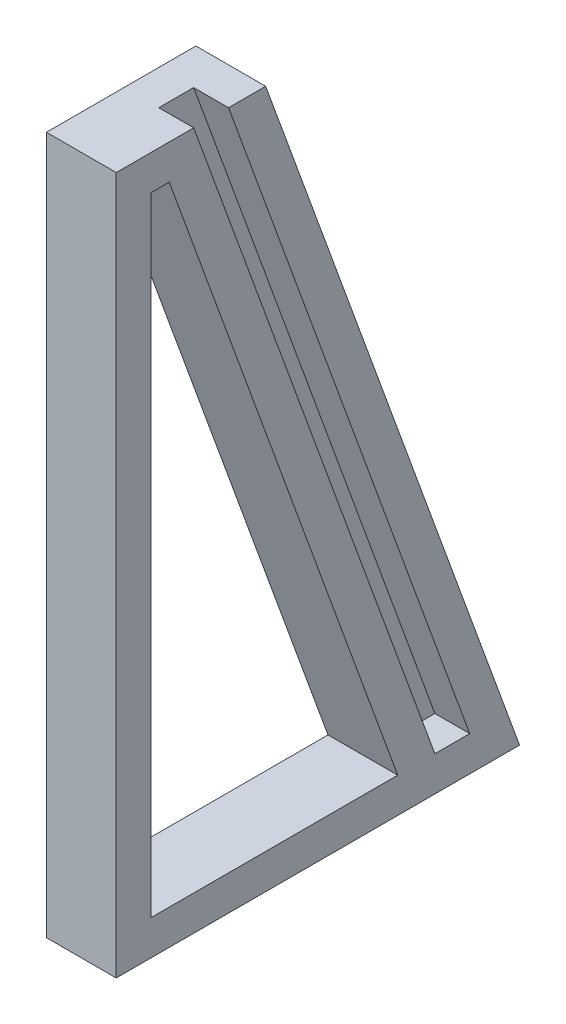
ISO-10303-21;
HEADER;
FILE_DESCRIPTION(('STEP AP214'),'2;1');
FILE_NAME('part.step','',(''),(''),'','','');
FILE_SCHEMA(('AUTOMOTIVE_DESIGN { 1 0 10303 214 1 1 1 1 }'));
ENDSEC;
DATA;
#1=APPLICATION_CONTEXT('core data for automotive mechanical design processes');
#2=APPLICATION_PROTOCOL_DEFINITION('international standard','automotive_design',2000,#1);
#3=PRODUCT_CONTEXT('',#1,'mechanical');
#4=PRODUCT('Part','Part','',(#3));
#5=PRODUCT_RELATED_PRODUCT_CATEGORY('part','',(#4));
#6=PRODUCT_DEFINITION_FORMATION('','',#4);
#7=PRODUCT_DEFINITION_CONTEXT('part definition',#1,'design');
#8=PRODUCT_DEFINITION('design','',#6,#7);
#9=PRODUCT_DEFINITION_SHAPE('','',#8);
#10=(LENGTH_UNIT() NAMED_UNIT(*) SI_UNIT(.MILLI.,.METRE.));
#11=(NAMED_UNIT(*) PLANE_ANGLE_UNIT() SI_UNIT($,.RADIAN.));
#12=(NAMED_UNIT(*) SI_UNIT($,.STERADIAN.) SOLID_ANGLE_UNIT());
#13=UNCERTAINTY_MEASURE_WITH_UNIT(LENGTH_MEASURE(1.E-05),#10,'distance_accuracy_value','');
#14=(GEOMETRIC_REPRESENTATION_CONTEXT(3) GLOBAL_UNCERTAINTY_ASSIGNED_CONTEXT((#13)) GLOBAL_UNIT_ASSIGNED_CONTEXT((#10,
#11,#12)) REPRESENTATION_CONTEXT('',''));
#15=CARTESIAN_POINT('',(0.,0.,0.));
#16=DIRECTION('',(0.,0.,1.));
#17=DIRECTION('',(1.,0.,0.));
#18=AXIS2_PLACEMENT_3D('',#15,#16,#17);
#19=CARTESIAN_POINT('',(10.,-50.,50.));
#20=DIRECTION('',(0.,1.,0.));
#21=DIRECTION('',(0.,0.,1.));
#22=AXIS2_PLACEMENT_3D('',#19,#20,#21);
#23=PLANE('',#22);
#24=DIRECTION('',(-1.,0.,0.));
#25=VECTOR('',#24,1.);
#26=CARTESIAN_POINT('',(0.,-50.,2.32088886));
#27=LINE('',#26,#25);
#28=CARTESIAN_POINT('',(8.,-50.,2.32088886));
#29=VERTEX_POINT('',#28);
#30=CARTESIAN_POINT('',(2.,-50.,2.32088886));
#31=VERTEX_POINT('',#30);
#32=EDGE_CURVE('E61',#29,#31,#27,.T.);
#33=ORIENTED_EDGE('',*,*,#32,.T.);
#34=DIRECTION('',(0.,0.,-1.));
#35=VECTOR('',#34,1.);
#36=CARTESIAN_POINT('',(2.,-50.,0.));
#37=LINE('',#36,#35);
#38=CARTESIAN_POINT('',(2.,-50.,8.32088886));
#39=VERTEX_POINT('',#38);
#40=EDGE_CURVE('E270',#39,#31,#37,.T.);
#41=ORIENTED_EDGE('',*,*,#40,.F.);
#42=DIRECTION('',(-1.,0.,0.));
#43=VECTOR('',#42,1.);
#44=CARTESIAN_POINT('',(0.,-50.,8.32088886));
#45=LINE('',#44,#43);
#46=CARTESIAN_POINT('',(8.,-50.,8.32088886));
#47=VERTEX_POINT('',#46);
#48=EDGE_CURVE('E283',#47,#39,#45,.T.);
#49=ORIENTED_EDGE('',*,*,#48,.F.);
#50=DIRECTION('',(0.,0.,-1.));
#51=VECTOR('',#50,1.);
#52=CARTESIAN_POINT('',(8.00000000000001,-50.,0.));
#53=LINE('',#52,#51);
#54=EDGE_CURVE('E280',#47,#29,#53,.T.);
#55=ORIENTED_EDGE('',*,*,#54,.T.);
#56=EDGE_LOOP('',(#33,#41,#49,#55));
#57=FACE_BOUND('',#56,.T.);
#58=DIRECTION('',(0.,0.,-1.));
#59=VECTOR('',#58,1.);
#60=CARTESIAN_POINT('',(2.00000000000001,-50.,0.));
#61=LINE('',#60,#59);
#62=CARTESIAN_POINT('',(2.,-50.,48.));
#63=VERTEX_POINT('',#62);
#64=CARTESIAN_POINT('',(2.,-50.,42.));
#65=VERTEX_POINT('',#64);
#66=EDGE_CURVE('E250',#63,#65,#61,.T.);
#67=ORIENTED_EDGE('',*,*,#66,.F.);
#68=DIRECTION('',(-1.,0.,0.));
#69=VECTOR('',#68,1.);
#70=CARTESIAN_POINT('',(0.,-50.,48.));
#71=LINE('',#70,#69);
#72=CARTESIAN_POINT('',(8.,-50.,48.));
#73=VERTEX_POINT('',#72);
#74=EDGE_CURVE('E53',#73,#63,#71,.T.);
#75=ORIENTED_EDGE('',*,*,#74,.F.);
#76=DIRECTION('',(0.,0.,-1.));
#77=VECTOR('',#76,1.);
#78=CARTESIAN_POINT('',(8.,-50.,0.));
#79=LINE('',#78,#77);
#80=CARTESIAN_POINT('',(8.,-50.,42.));
#81=VERTEX_POINT('',#80);
#82=EDGE_CURVE('E241',#73,#81,#79,.T.);
#83=ORIENTED_EDGE('',*,*,#82,.T.);
#84=DIRECTION('',(-1.,0.,0.));
#85=VECTOR('',#84,1.);
#86=CARTESIAN_POINT('',(0.,-50.,42.));
#87=LINE('',#86,#85);
#88=EDGE_CURVE('E254',#81,#65,#87,.T.);
#89=ORIENTED_EDGE('',*,*,#88,.T.);
#90=EDGE_LOOP('',(#67,#75,#83,#89));
#91=FACE_BOUND('',#90,.T.);
#92=DIRECTION('',(0.,0.,-1.));
#93=VECTOR('',#92,1.);
#94=CARTESIAN_POINT('',(0.,-50.,50.));
#95=LINE('',#94,#93);
#96=CARTESIAN_POINT('',(0.,-50.,50.));
#97=VERTEX_POINT('',#96);
#98=CARTESIAN_POINT('',(0.,-50.,-7.82088886237959));
#99=VERTEX_POINT('',#98);
#100=EDGE_CURVE('E192',#97,#99,#95,.T.);
#101=ORIENTED_EDGE('',*,*,#100,.T.);
#102=DIRECTION('',(-1.,0.,0.));
#103=VECTOR('',#102,1.);
#104=CARTESIAN_POINT('',(10.,-50.,-7.82088886237959));
#105=LINE('',#104,#103);
#106=CARTESIAN_POINT('',(10.,-50.,-7.82088886237959));
#107=VERTEX_POINT('',#106);
#108=EDGE_CURVE('E190',#107,#99,#105,.T.);
#109=ORIENTED_EDGE('',*,*,#108,.F.);
#110=DIRECTION('',(0.,0.,-1.));
#111=VECTOR('',#110,1.);
#112=CARTESIAN_POINT('',(10.,-50.,50.));
#113=LINE('',#112,#111);
#114=CARTESIAN_POINT('',(10.,-50.,50.));
#115=VERTEX_POINT('',#114);
#116=EDGE_CURVE('E176',#115,#107,#113,.T.);
#117=ORIENTED_EDGE('',*,*,#116,.F.);
#118=DIRECTION('',(-1.,0.,0.));
#119=VECTOR('',#118,1.);
#120=CARTESIAN_POINT('',(10.,-50.,50.));
#121=LINE('',#120,#119);
#122=EDGE_CURVE('E46',#115,#97,#121,.T.);
#123=ORIENTED_EDGE('',*,*,#122,.T.);
#124=EDGE_LOOP('',(#101,#109,#117,#123));
#125=FACE_BOUND('',#124,.T.);
#126=ADVANCED_FACE('F38',(#57,#91,#125),#23,.F.);
#127=CARTESIAN_POINT('',(10.,0.,0.));
#128=DIRECTION('',(1.,0.,0.));
#129=DIRECTION('',(0.,0.,-1.));
#130=AXIS2_PLACEMENT_3D('',#127,#128,#129);
#131=PLANE('',#130);
#132=DIRECTION('',(0.,-0.939692620785907,-0.342020143325673));
#133=VECTOR('',#132,1.);
#134=CARTESIAN_POINT('',(10.,-45.,4.31985117133103));
#135=LINE('',#134,#133);
#136=CARTESIAN_POINT('',(10.,50.,38.8970234266207));
#137=VERTEX_POINT('',#136);
#138=CARTESIAN_POINT('',(10.,-45.,4.31985117133103));
#139=VERTEX_POINT('',#138);
#140=EDGE_CURVE('E212',#137,#139,#135,.T.);
#141=ORIENTED_EDGE('',*,*,#140,.F.);
#142=DIRECTION('',(0.,0.,1.));
#143=VECTOR('',#142,1.);
#144=CARTESIAN_POINT('',(10.,50.,50.));
#145=LINE('',#144,#143);
#146=CARTESIAN_POINT('',(10.,50.,50.));
#147=VERTEX_POINT('',#146);
#148=EDGE_CURVE('E325',#137,#147,#145,.T.);
#149=ORIENTED_EDGE('',*,*,#148,.T.);
#150=DIRECTION('',(0.,-1.,0.));
#151=VECTOR('',#150,1.);
#152=CARTESIAN_POINT('',(10.,50.,50.));
#153=LINE('',#152,#151);
#154=EDGE_CURVE('E184',#147,#115,#153,.T.);
#155=ORIENTED_EDGE('',*,*,#154,.T.);
#156=ORIENTED_EDGE('',*,*,#116,.T.);
#157=DIRECTION('',(0.,-0.939692620785907,-0.342020143325672));
#158=VECTOR('',#157,1.);
#159=CARTESIAN_POINT('',(10.,-3.33530369328913,9.16367158433538));
#160=LINE('',#159,#158);
#161=CARTESIAN_POINT('',(10.,50.,28.5761345642411));
#162=VERTEX_POINT('',#161);
#163=EDGE_CURVE('E182',#162,#107,#160,.T.);
#164=ORIENTED_EDGE('',*,*,#163,.F.);
#165=DIRECTION('',(0.,0.,1.));
#166=VECTOR('',#165,1.);
#167=CARTESIAN_POINT('',(10.,50.,0.));
#168=LINE('',#167,#166);
#169=CARTESIAN_POINT('',(10.,50.,33.8970234266207));
#170=VERTEX_POINT('',#169);
#171=EDGE_CURVE('E197',#162,#170,#168,.T.);
#172=ORIENTED_EDGE('',*,*,#171,.T.);
#173=DIRECTION('',(0.,-0.939692620785907,-0.342020143325673));
#174=VECTOR('',#173,1.);
#175=CARTESIAN_POINT('',(10.,-5.0454044099175,13.8621346882649));
#176=LINE('',#175,#174);
#177=CARTESIAN_POINT('',(10.,-45.,-0.680148828668979));
#178=VERTEX_POINT('',#177);
#179=EDGE_CURVE('E203',#170,#178,#176,.T.);
#180=ORIENTED_EDGE('',*,*,#179,.T.);
#181=DIRECTION('',(0.,0.,-1.));
#182=VECTOR('',#181,1.);
#183=CARTESIAN_POINT('',(10.,-45.,-0.680148828668972));
#184=LINE('',#183,#182);
#185=EDGE_CURVE('E218',#139,#178,#184,.T.);
#186=ORIENTED_EDGE('',*,*,#185,.F.);
#187=EDGE_LOOP('',(#141,#149,#155,#156,#164,#172,#180,#186));
#188=FACE_BOUND('',#187,.T.);
#189=DIRECTION('',(0.,-1.,0.));
#190=VECTOR('',#189,1.);
#191=CARTESIAN_POINT('',(10.,0.,45.));
#192=LINE('',#191,#190);
#193=CARTESIAN_POINT('',(10.,45.,45.));
#194=VERTEX_POINT('',#193);
#195=CARTESIAN_POINT('',(10.,-45.,45.));
#196=VERTEX_POINT('',#195);
#197=EDGE_CURVE('E302',#194,#196,#192,.T.);
#198=ORIENTED_EDGE('',*,*,#197,.F.);
#199=DIRECTION('',(0.,0.,1.));
#200=VECTOR('',#199,1.);
#201=CARTESIAN_POINT('',(10.,45.0000000000001,1.20006748735049E-13));
#202=LINE('',#201,#200);
#203=CARTESIAN_POINT('',(10.,45.,42.3980611176692));
#204=VERTEX_POINT('',#203);
#205=EDGE_CURVE('E294',#204,#194,#202,.T.);
#206=ORIENTED_EDGE('',*,*,#205,.F.);
#207=DIRECTION('',(0.,0.939692620785907,0.342020143325672));
#208=VECTOR('',#207,1.);
#209=CARTESIAN_POINT('',(10.,-8.36247415076222,22.9757088999919));
#210=LINE('',#209,#208);
#211=CARTESIAN_POINT('',(10.,-45.,9.64074003371058));
#212=VERTEX_POINT('',#211);
#213=EDGE_CURVE('E296',#212,#204,#210,.T.);
#214=ORIENTED_EDGE('',*,*,#213,.F.);
#215=DIRECTION('',(0.,0.,-1.));
#216=VECTOR('',#215,1.);
#217=CARTESIAN_POINT('',(10.,-45.,0.));
#218=LINE('',#217,#216);
#219=EDGE_CURVE('E299',#196,#212,#218,.T.);
#220=ORIENTED_EDGE('',*,*,#219,.F.);
#221=EDGE_LOOP('',(#198,#206,#214,#220));
#222=FACE_BOUND('',#221,.T.);
#223=ADVANCED_FACE('F179',(#188,#222),#131,.T.);
#224=CARTESIAN_POINT('',(0.,0.,0.));
#225=DIRECTION('',(1.,0.,0.));
#226=DIRECTION('',(0.,0.,-1.));
#227=AXIS2_PLACEMENT_3D('',#224,#225,#226);
#228=PLANE('',#227);
#229=DIRECTION('',(0.,0.,1.));
#230=VECTOR('',#229,1.);
#231=CARTESIAN_POINT('',(0.,45.0000000000001,1.20006748735049E-13));
#232=LINE('',#231,#230);
#233=CARTESIAN_POINT('',(0.,45.,42.3980611176692));
#234=VERTEX_POINT('',#233);
#235=CARTESIAN_POINT('',(0.,45.,45.));
#236=VERTEX_POINT('',#235);
#237=EDGE_CURVE('E261',#234,#236,#232,.T.);
#238=ORIENTED_EDGE('',*,*,#237,.T.);
#239=DIRECTION('',(0.,-1.,0.));
#240=VECTOR('',#239,1.);
#241=CARTESIAN_POINT('',(0.,0.,45.));
#242=LINE('',#241,#240);
#243=CARTESIAN_POINT('',(0.,-45.,45.));
#244=VERTEX_POINT('',#243);
#245=EDGE_CURVE('E297',#236,#244,#242,.T.);
#246=ORIENTED_EDGE('',*,*,#245,.T.);
#247=DIRECTION('',(0.,0.,-1.));
#248=VECTOR('',#247,1.);
#249=CARTESIAN_POINT('',(0.,-45.,0.));
#250=LINE('',#249,#248);
#251=CARTESIAN_POINT('',(0.,-45.,9.64074003371059));
#252=VERTEX_POINT('',#251);
#253=EDGE_CURVE('E310',#244,#252,#250,.T.);
#254=ORIENTED_EDGE('',*,*,#253,.T.);
#255=DIRECTION('',(0.,0.939692620785907,0.342020143325672));
#256=VECTOR('',#255,1.);
#257=CARTESIAN_POINT('',(0.,-8.36247415076222,22.9757088999919));
#258=LINE('',#257,#256);
#259=EDGE_CURVE('E307',#252,#234,#258,.T.);
#260=ORIENTED_EDGE('',*,*,#259,.T.);
#261=EDGE_LOOP('',(#238,#246,#254,#260));
#262=FACE_BOUND('',#261,.T.);
#263=DIRECTION('',(0.,0.,1.));
#264=VECTOR('',#263,1.);
#265=CARTESIAN_POINT('',(0.,50.,50.));
#266=LINE('',#265,#264);
#267=CARTESIAN_POINT('',(0.,50.,28.5761345642411));
#268=VERTEX_POINT('',#267);
#269=CARTESIAN_POINT('',(0.,50.,50.));
#270=VERTEX_POINT('',#269);
#271=EDGE_CURVE('E318',#268,#270,#266,.T.);
#272=ORIENTED_EDGE('',*,*,#271,.F.);
#273=DIRECTION('',(0.,-0.939692620785907,-0.342020143325672));
#274=VECTOR('',#273,1.);
#275=CARTESIAN_POINT('',(0.,-3.33530369328913,9.16367158433538));
#276=LINE('',#275,#274);
#277=EDGE_CURVE('E204',#268,#99,#276,.T.);
#278=ORIENTED_EDGE('',*,*,#277,.T.);
#279=ORIENTED_EDGE('',*,*,#100,.F.);
#280=DIRECTION('',(0.,-1.,0.));
#281=VECTOR('',#280,1.);
#282=CARTESIAN_POINT('',(0.,50.,50.));
#283=LINE('',#282,#281);
#284=EDGE_CURVE('E329',#270,#97,#283,.T.);
#285=ORIENTED_EDGE('',*,*,#284,.F.);
#286=EDGE_LOOP('',(#272,#278,#279,#285));
#287=FACE_BOUND('',#286,.T.);
#288=ADVANCED_FACE('F334',(#262,#287),#228,.F.);
#289=CARTESIAN_POINT('',(10.,50.,50.));
#290=DIRECTION('',(0.,-1.,0.));
#291=DIRECTION('',(0.,0.,-1.));
#292=AXIS2_PLACEMENT_3D('',#289,#290,#291);
#293=PLANE('',#292);
#294=ORIENTED_EDGE('',*,*,#148,.F.);
#295=DIRECTION('',(1.,0.,0.));
#296=VECTOR('',#295,1.);
#297=CARTESIAN_POINT('',(5.,50.,38.8970234266207));
#298=LINE('',#297,#296);
#299=CARTESIAN_POINT('',(5.,50.,38.8970234266207));
#300=VERTEX_POINT('',#299);
#301=EDGE_CURVE('E232',#300,#137,#298,.T.);
#302=ORIENTED_EDGE('',*,*,#301,.F.);
#303=DIRECTION('',(0.,0.,1.));
#304=VECTOR('',#303,1.);
#305=CARTESIAN_POINT('',(5.,50.,38.8970234266207));
#306=LINE('',#305,#304);
#307=CARTESIAN_POINT('',(5.,50.,33.8970234266207));
#308=VERTEX_POINT('',#307);
#309=EDGE_CURVE('E224',#308,#300,#306,.T.);
#310=ORIENTED_EDGE('',*,*,#309,.F.);
#311=DIRECTION('',(-1.,0.,0.));
#312=VECTOR('',#311,1.);
#313=CARTESIAN_POINT('',(10.,50.,33.8970234266207));
#314=LINE('',#313,#312);
#315=EDGE_CURVE('E196',#170,#308,#314,.T.);
#316=ORIENTED_EDGE('',*,*,#315,.F.);
#317=ORIENTED_EDGE('',*,*,#171,.F.);
#318=DIRECTION('',(-1.,0.,0.));
#319=VECTOR('',#318,1.);
#320=CARTESIAN_POINT('',(10.,50.,28.5761345642411));
#321=LINE('',#320,#319);
#322=EDGE_CURVE('E201',#162,#268,#321,.T.);
#323=ORIENTED_EDGE('',*,*,#322,.T.);
#324=ORIENTED_EDGE('',*,*,#271,.T.);
#325=DIRECTION('',(-1.,0.,0.));
#326=VECTOR('',#325,1.);
#327=CARTESIAN_POINT('',(10.,50.,50.));
#328=LINE('',#327,#326);
#329=EDGE_CURVE('E11',#147,#270,#328,.T.);
#330=ORIENTED_EDGE('',*,*,#329,.F.);
#331=EDGE_LOOP('',(#294,#302,#310,#316,#317,#323,#324,#330));
#332=FACE_BOUND('',#331,.T.);
#333=ADVANCED_FACE('F40',(#332),#293,.F.);
#334=CARTESIAN_POINT('',(10.,50.,50.));
#335=DIRECTION('',(0.,0.,-1.));
#336=DIRECTION('',(0.,1.,0.));
#337=AXIS2_PLACEMENT_3D('',#334,#335,#336);
#338=PLANE('',#337);
#339=ORIENTED_EDGE('',*,*,#284,.T.);
#340=ORIENTED_EDGE('',*,*,#122,.F.);
#341=ORIENTED_EDGE('',*,*,#154,.F.);
#342=ORIENTED_EDGE('',*,*,#329,.T.);
#343=EDGE_LOOP('',(#339,#340,#341,#342));
#344=FACE_BOUND('',#343,.T.);
#345=ADVANCED_FACE('F350',(#344),#338,.F.);
#346=CARTESIAN_POINT('',(10.,45.0000000000001,1.20006748735049E-13));
#347=DIRECTION('',(0.,-1.,0.));
#348=DIRECTION('',(0.,0.,-1.));
#349=AXIS2_PLACEMENT_3D('',#346,#347,#348);
#350=PLANE('',#349);
#351=ORIENTED_EDGE('',*,*,#237,.F.);
#352=DIRECTION('',(-1.,0.,0.));
#353=VECTOR('',#352,1.);
#354=CARTESIAN_POINT('',(10.,45.,42.3980611176692));
#355=LINE('',#354,#353);
#356=EDGE_CURVE('E304',#204,#234,#355,.T.);
#357=ORIENTED_EDGE('',*,*,#356,.F.);
#358=ORIENTED_EDGE('',*,*,#205,.T.);
#359=DIRECTION('',(-1.,0.,0.));
#360=VECTOR('',#359,1.);
#361=CARTESIAN_POINT('',(10.,45.,45.));
#362=LINE('',#361,#360);
#363=EDGE_CURVE('E315',#194,#236,#362,.T.);
#364=ORIENTED_EDGE('',*,*,#363,.T.);
#365=EDGE_LOOP('',(#351,#357,#358,#364));
#366=FACE_BOUND('',#365,.T.);
#367=ADVANCED_FACE('F352',(#366),#350,.T.);
#368=CARTESIAN_POINT('',(10.,0.,45.));
#369=DIRECTION('',(0.,0.,-1.));
#370=DIRECTION('',(-1.,0.,0.));
#371=AXIS2_PLACEMENT_3D('',#368,#369,#370);
#372=PLANE('',#371);
#373=ORIENTED_EDGE('',*,*,#245,.F.);
#374=ORIENTED_EDGE('',*,*,#363,.F.);
#375=ORIENTED_EDGE('',*,*,#197,.T.);
#376=DIRECTION('',(-1.,0.,0.));
#377=VECTOR('',#376,1.);
#378=CARTESIAN_POINT('',(10.,-45.,45.));
#379=LINE('',#378,#377);
#380=EDGE_CURVE('E319',#196,#244,#379,.T.);
#381=ORIENTED_EDGE('',*,*,#380,.T.);
#382=EDGE_LOOP('',(#373,#374,#375,#381));
#383=FACE_BOUND('',#382,.T.);
#384=ADVANCED_FACE('F357',(#383),#372,.T.);
#385=CARTESIAN_POINT('',(10.,-45.,0.));
#386=DIRECTION('',(0.,1.,0.));
#387=DIRECTION('',(0.,0.,1.));
#388=AXIS2_PLACEMENT_3D('',#385,#386,#387);
#389=PLANE('',#388);
#390=ORIENTED_EDGE('',*,*,#253,.F.);
#391=ORIENTED_EDGE('',*,*,#380,.F.);
#392=ORIENTED_EDGE('',*,*,#219,.T.);
#393=DIRECTION('',(-1.,0.,0.));
#394=VECTOR('',#393,1.);
#395=CARTESIAN_POINT('',(10.,-45.,9.64074003371059));
#396=LINE('',#395,#394);
#397=EDGE_CURVE('E321',#212,#252,#396,.T.);
#398=ORIENTED_EDGE('',*,*,#397,.T.);
#399=EDGE_LOOP('',(#390,#391,#392,#398));
#400=FACE_BOUND('',#399,.T.);
#401=ADVANCED_FACE('F376',(#400),#389,.T.);
#402=CARTESIAN_POINT('',(10.,-8.36247415076222,22.9757088999919));
#403=DIRECTION('',(0.,-0.342020143325672,0.939692620785907));
#404=DIRECTION('',(0.,-0.939692620785907,-0.342020143325672));
#405=AXIS2_PLACEMENT_3D('',#402,#403,#404);
#406=PLANE('',#405);
#407=ORIENTED_EDGE('',*,*,#259,.F.);
#408=ORIENTED_EDGE('',*,*,#397,.F.);
#409=ORIENTED_EDGE('',*,*,#213,.T.);
#410=ORIENTED_EDGE('',*,*,#356,.T.);
#411=EDGE_LOOP('',(#407,#408,#409,#410));
#412=FACE_BOUND('',#411,.T.);
#413=ADVANCED_FACE('F372',(#412),#406,.T.);
#414=CARTESIAN_POINT('',(0.,-46.,2.32088886));
#415=DIRECTION('',(0.,0.,1.));
#416=DIRECTION('',(1.,0.,0.));
#417=AXIS2_PLACEMENT_3D('',#414,#415,#416);
#418=PLANE('',#417);
#419=ORIENTED_EDGE('',*,*,#32,.F.);
#420=DIRECTION('',(0.,-1.,0.));
#421=VECTOR('',#420,1.);
#422=CARTESIAN_POINT('',(8.,-46.,2.32088886));
#423=LINE('',#422,#421);
#424=CARTESIAN_POINT('',(8.,-46.,2.32088886));
#425=VERTEX_POINT('',#424);
#426=EDGE_CURVE('E278',#425,#29,#423,.T.);
#427=ORIENTED_EDGE('',*,*,#426,.F.);
#428=DIRECTION('',(-1.,0.,0.));
#429=VECTOR('',#428,1.);
#430=CARTESIAN_POINT('',(0.,-46.,2.32088886));
#431=LINE('',#430,#429);
#432=CARTESIAN_POINT('',(2.,-46.,2.32088886));
#433=VERTEX_POINT('',#432);
#434=EDGE_CURVE('E267',#425,#433,#431,.T.);
#435=ORIENTED_EDGE('',*,*,#434,.T.);
#436=DIRECTION('',(0.,-1.,0.));
#437=VECTOR('',#436,1.);
#438=CARTESIAN_POINT('',(2.,-46.,2.32088886));
#439=LINE('',#438,#437);
#440=EDGE_CURVE('E251',#433,#31,#439,.T.);
#441=ORIENTED_EDGE('',*,*,#440,.T.);
#442=EDGE_LOOP('',(#419,#427,#435,#441));
#443=FACE_BOUND('',#442,.T.);
#444=ADVANCED_FACE('F375',(#443),#418,.T.);
#445=CARTESIAN_POINT('',(2.,-46.,0.));
#446=DIRECTION('',(-1.,0.,0.));
#447=DIRECTION('',(0.,0.,1.));
#448=AXIS2_PLACEMENT_3D('',#445,#446,#447);
#449=PLANE('',#448);
#450=ORIENTED_EDGE('',*,*,#40,.T.);
#451=ORIENTED_EDGE('',*,*,#440,.F.);
#452=DIRECTION('',(0.,0.,-1.));
#453=VECTOR('',#452,1.);
#454=CARTESIAN_POINT('',(2.,-46.,0.));
#455=LINE('',#454,#453);
#456=CARTESIAN_POINT('',(2.,-46.,8.32088886));
#457=VERTEX_POINT('',#456);
#458=EDGE_CURVE('E275',#457,#433,#455,.T.);
#459=ORIENTED_EDGE('',*,*,#458,.F.);
#460=DIRECTION('',(0.,-1.,0.));
#461=VECTOR('',#460,1.);
#462=CARTESIAN_POINT('',(2.,-46.,8.32088886));
#463=LINE('',#462,#461);
#464=EDGE_CURVE('E289',#457,#39,#463,.T.);
#465=ORIENTED_EDGE('',*,*,#464,.T.);
#466=EDGE_LOOP('',(#450,#451,#459,#465));
#467=FACE_BOUND('',#466,.T.);
#468=ADVANCED_FACE('F386',(#467),#449,.F.);
#469=CARTESIAN_POINT('',(0.,-46.,8.32088886));
#470=DIRECTION('',(0.,0.,1.));
#471=DIRECTION('',(1.,0.,0.));
#472=AXIS2_PLACEMENT_3D('',#469,#470,#471);
#473=PLANE('',#472);
#474=ORIENTED_EDGE('',*,*,#48,.T.);
#475=ORIENTED_EDGE('',*,*,#464,.F.);
#476=DIRECTION('',(-1.,0.,0.));
#477=VECTOR('',#476,1.);
#478=CARTESIAN_POINT('',(0.,-46.,8.32088886));
#479=LINE('',#478,#477);
#480=CARTESIAN_POINT('',(8.,-46.,8.32088886));
#481=VERTEX_POINT('',#480);
#482=EDGE_CURVE('E272',#481,#457,#479,.T.);
#483=ORIENTED_EDGE('',*,*,#482,.F.);
#484=DIRECTION('',(0.,-1.,0.));
#485=VECTOR('',#484,1.);
#486=CARTESIAN_POINT('',(8.,-46.,8.32088886));
#487=LINE('',#486,#485);
#488=EDGE_CURVE('E291',#481,#47,#487,.T.);
#489=ORIENTED_EDGE('',*,*,#488,.T.);
#490=EDGE_LOOP('',(#474,#475,#483,#489));
#491=FACE_BOUND('',#490,.T.);
#492=ADVANCED_FACE('F391',(#491),#473,.F.);
#493=CARTESIAN_POINT('',(8.00000000000001,-46.,0.));
#494=DIRECTION('',(-1.,0.,0.));
#495=DIRECTION('',(0.,0.,1.));
#496=AXIS2_PLACEMENT_3D('',#493,#494,#495);
#497=PLANE('',#496);
#498=ORIENTED_EDGE('',*,*,#54,.F.);
#499=ORIENTED_EDGE('',*,*,#488,.F.);
#500=DIRECTION('',(0.,0.,-1.));
#501=VECTOR('',#500,1.);
#502=CARTESIAN_POINT('',(8.00000000000001,-46.,0.));
#503=LINE('',#502,#501);
#504=EDGE_CURVE('E269',#481,#425,#503,.T.);
#505=ORIENTED_EDGE('',*,*,#504,.T.);
#506=ORIENTED_EDGE('',*,*,#426,.T.);
#507=EDGE_LOOP('',(#498,#499,#505,#506));
#508=FACE_BOUND('',#507,.T.);
#509=ADVANCED_FACE('F387',(#508),#497,.T.);
#510=CARTESIAN_POINT('',(0.,-46.,0.));
#511=DIRECTION('',(0.,-1.,0.));
#512=DIRECTION('',(0.,0.,-1.));
#513=AXIS2_PLACEMENT_3D('',#510,#511,#512);
#514=PLANE('',#513);
#515=ORIENTED_EDGE('',*,*,#434,.F.);
#516=ORIENTED_EDGE('',*,*,#504,.F.);
#517=ORIENTED_EDGE('',*,*,#482,.T.);
#518=ORIENTED_EDGE('',*,*,#458,.T.);
#519=EDGE_LOOP('',(#515,#516,#517,#518));
#520=FACE_BOUND('',#519,.T.);
#521=ADVANCED_FACE('F390',(#520),#514,.T.);
#522=CARTESIAN_POINT('',(0.,-46.,48.));
#523=DIRECTION('',(0.,0.,1.));
#524=DIRECTION('',(1.,0.,0.));
#525=AXIS2_PLACEMENT_3D('',#522,#523,#524);
#526=PLANE('',#525);
#527=ORIENTED_EDGE('',*,*,#74,.T.);
#528=DIRECTION('',(0.,-1.,0.));
#529=VECTOR('',#528,1.);
#530=CARTESIAN_POINT('',(2.,-46.,48.));
#531=LINE('',#530,#529);
#532=CARTESIAN_POINT('',(2.,-46.,48.));
#533=VERTEX_POINT('',#532);
#534=EDGE_CURVE('E248',#533,#63,#531,.T.);
#535=ORIENTED_EDGE('',*,*,#534,.F.);
#536=DIRECTION('',(-1.,0.,0.));
#537=VECTOR('',#536,1.);
#538=CARTESIAN_POINT('',(0.,-46.,48.));
#539=LINE('',#538,#537);
#540=CARTESIAN_POINT('',(8.,-46.,48.));
#541=VERTEX_POINT('',#540);
#542=EDGE_CURVE('E237',#541,#533,#539,.T.);
#543=ORIENTED_EDGE('',*,*,#542,.F.);
#544=DIRECTION('',(0.,-1.,0.));
#545=VECTOR('',#544,1.);
#546=CARTESIAN_POINT('',(8.,-46.,48.));
#547=LINE('',#546,#545);
#548=EDGE_CURVE('E259',#541,#73,#547,.T.);
#549=ORIENTED_EDGE('',*,*,#548,.T.);
#550=EDGE_LOOP('',(#527,#535,#543,#549));
#551=FACE_BOUND('',#550,.T.);
#552=ADVANCED_FACE('F401',(#551),#526,.F.);
#553=CARTESIAN_POINT('',(8.,-46.,0.));
#554=DIRECTION('',(-1.,0.,0.));
#555=DIRECTION('',(0.,0.,1.));
#556=AXIS2_PLACEMENT_3D('',#553,#554,#555);
#557=PLANE('',#556);
#558=ORIENTED_EDGE('',*,*,#82,.F.);
#559=ORIENTED_EDGE('',*,*,#548,.F.);
#560=DIRECTION('',(0.,0.,-1.));
#561=VECTOR('',#560,1.);
#562=CARTESIAN_POINT('',(8.,-46.,0.));
#563=LINE('',#562,#561);
#564=CARTESIAN_POINT('',(8.,-46.,42.));
#565=VERTEX_POINT('',#564);
#566=EDGE_CURVE('E246',#541,#565,#563,.T.);
#567=ORIENTED_EDGE('',*,*,#566,.T.);
#568=DIRECTION('',(0.,-1.,0.));
#569=VECTOR('',#568,1.);
#570=CARTESIAN_POINT('',(8.,-46.,42.));
#571=LINE('',#570,#569);
#572=EDGE_CURVE('E262',#565,#81,#571,.T.);
#573=ORIENTED_EDGE('',*,*,#572,.T.);
#574=EDGE_LOOP('',(#558,#559,#567,#573));
#575=FACE_BOUND('',#574,.T.);
#576=ADVANCED_FACE('F405',(#575),#557,.T.);
#577=CARTESIAN_POINT('',(0.,-46.,42.));
#578=DIRECTION('',(0.,0.,1.));
#579=DIRECTION('',(1.,0.,0.));
#580=AXIS2_PLACEMENT_3D('',#577,#578,#579);
#581=PLANE('',#580);
#582=ORIENTED_EDGE('',*,*,#88,.F.);
#583=ORIENTED_EDGE('',*,*,#572,.F.);
#584=DIRECTION('',(-1.,0.,0.));
#585=VECTOR('',#584,1.);
#586=CARTESIAN_POINT('',(0.,-46.,42.));
#587=LINE('',#586,#585);
#588=CARTESIAN_POINT('',(2.,-46.,42.));
#589=VERTEX_POINT('',#588);
#590=EDGE_CURVE('E244',#565,#589,#587,.T.);
#591=ORIENTED_EDGE('',*,*,#590,.T.);
#592=DIRECTION('',(0.,-1.,0.));
#593=VECTOR('',#592,1.);
#594=CARTESIAN_POINT('',(2.,-46.,42.));
#595=LINE('',#594,#593);
#596=EDGE_CURVE('E264',#589,#65,#595,.T.);
#597=ORIENTED_EDGE('',*,*,#596,.T.);
#598=EDGE_LOOP('',(#582,#583,#591,#597));
#599=FACE_BOUND('',#598,.T.);
#600=ADVANCED_FACE('F410',(#599),#581,.T.);
#601=CARTESIAN_POINT('',(2.00000000000001,-46.,0.));
#602=DIRECTION('',(-1.,0.,0.));
#603=DIRECTION('',(0.,0.,1.));
#604=AXIS2_PLACEMENT_3D('',#601,#602,#603);
#605=PLANE('',#604);
#606=ORIENTED_EDGE('',*,*,#66,.T.);
#607=ORIENTED_EDGE('',*,*,#596,.F.);
#608=DIRECTION('',(0.,0.,-1.));
#609=VECTOR('',#608,1.);
#610=CARTESIAN_POINT('',(2.00000000000001,-46.,0.));
#611=LINE('',#610,#609);
#612=EDGE_CURVE('E240',#533,#589,#611,.T.);
#613=ORIENTED_EDGE('',*,*,#612,.F.);
#614=ORIENTED_EDGE('',*,*,#534,.T.);
#615=EDGE_LOOP('',(#606,#607,#613,#614));
#616=FACE_BOUND('',#615,.T.);
#617=ADVANCED_FACE('F406',(#616),#605,.F.);
#618=CARTESIAN_POINT('',(0.,-46.,0.));
#619=DIRECTION('',(0.,-1.,0.));
#620=DIRECTION('',(0.,0.,-1.));
#621=AXIS2_PLACEMENT_3D('',#618,#619,#620);
#622=PLANE('',#621);
#623=ORIENTED_EDGE('',*,*,#542,.T.);
#624=ORIENTED_EDGE('',*,*,#612,.T.);
#625=ORIENTED_EDGE('',*,*,#590,.F.);
#626=ORIENTED_EDGE('',*,*,#566,.F.);
#627=EDGE_LOOP('',(#623,#624,#625,#626));
#628=FACE_BOUND('',#627,.T.);
#629=ADVANCED_FACE('F409',(#628),#622,.T.);
#630=CARTESIAN_POINT('',(5.,-45.,4.31985117133103));
#631=DIRECTION('',(0.,-0.342020143325672,0.939692620785907));
#632=DIRECTION('',(0.,-0.939692620785907,-0.342020143325672));
#633=AXIS2_PLACEMENT_3D('',#630,#631,#632);
#634=PLANE('',#633);
#635=ORIENTED_EDGE('',*,*,#140,.T.);
#636=DIRECTION('',(1.,0.,0.));
#637=VECTOR('',#636,1.);
#638=CARTESIAN_POINT('',(5.,-45.,4.31985117133103));
#639=LINE('',#638,#637);
#640=CARTESIAN_POINT('',(5.,-45.,4.31985117133103));
#641=VERTEX_POINT('',#640);
#642=EDGE_CURVE('E227',#641,#139,#639,.T.);
#643=ORIENTED_EDGE('',*,*,#642,.F.);
#644=DIRECTION('',(0.,-0.939692620785907,-0.342020143325673));
#645=VECTOR('',#644,1.);
#646=CARTESIAN_POINT('',(5.,-45.,4.31985117133103));
#647=LINE('',#646,#645);
#648=EDGE_CURVE('E214',#300,#641,#647,.T.);
#649=ORIENTED_EDGE('',*,*,#648,.F.);
#650=ORIENTED_EDGE('',*,*,#301,.T.);
#651=EDGE_LOOP('',(#635,#643,#649,#650));
#652=FACE_BOUND('',#651,.T.);
#653=ADVANCED_FACE('F348',(#652),#634,.F.);
#654=CARTESIAN_POINT('',(5.,-45.,-0.680148828668972));
#655=DIRECTION('',(0.,-1.,0.));
#656=DIRECTION('',(0.,0.,-1.));
#657=AXIS2_PLACEMENT_3D('',#654,#655,#656);
#658=PLANE('',#657);
#659=ORIENTED_EDGE('',*,*,#185,.T.);
#660=DIRECTION('',(1.,0.,0.));
#661=VECTOR('',#660,1.);
#662=CARTESIAN_POINT('',(5.,-45.,-0.680148828668972));
#663=LINE('',#662,#661);
#664=CARTESIAN_POINT('',(5.,-45.,-0.680148828668981));
#665=VERTEX_POINT('',#664);
#666=EDGE_CURVE('E234',#665,#178,#663,.T.);
#667=ORIENTED_EDGE('',*,*,#666,.F.);
#668=DIRECTION('',(0.,0.,-1.));
#669=VECTOR('',#668,1.);
#670=CARTESIAN_POINT('',(5.,-45.,-0.680148828668972));
#671=LINE('',#670,#669);
#672=EDGE_CURVE('E217',#641,#665,#671,.T.);
#673=ORIENTED_EDGE('',*,*,#672,.F.);
#674=ORIENTED_EDGE('',*,*,#642,.T.);
#675=EDGE_LOOP('',(#659,#667,#673,#674));
#676=FACE_BOUND('',#675,.T.);
#677=ADVANCED_FACE('F345',(#676),#658,.F.);
#678=CARTESIAN_POINT('',(5.,0.,0.));
#679=DIRECTION('',(-1.,0.,0.));
#680=DIRECTION('',(0.,0.,1.));
#681=AXIS2_PLACEMENT_3D('',#678,#679,#680);
#682=PLANE('',#681);
#683=ORIENTED_EDGE('',*,*,#648,.T.);
#684=ORIENTED_EDGE('',*,*,#672,.T.);
#685=DIRECTION('',(0.,0.939692620785907,0.342020143325672));
#686=VECTOR('',#685,1.);
#687=CARTESIAN_POINT('',(5.,50.,33.8970234266207));
#688=LINE('',#687,#686);
#689=EDGE_CURVE('E221',#665,#308,#688,.T.);
#690=ORIENTED_EDGE('',*,*,#689,.T.);
#691=ORIENTED_EDGE('',*,*,#309,.T.);
#692=EDGE_LOOP('',(#683,#684,#690,#691));
#693=FACE_BOUND('',#692,.T.);
#694=ADVANCED_FACE('F425',(#693),#682,.F.);
#695=CARTESIAN_POINT('',(10.,-5.0454044099175,13.8621346882649));
#696=DIRECTION('',(0.,0.342020143325673,-0.939692620785907));
#697=DIRECTION('',(0.,0.939692620785907,0.342020143325673));
#698=AXIS2_PLACEMENT_3D('',#695,#696,#697);
#699=PLANE('',#698);
#700=ORIENTED_EDGE('',*,*,#689,.F.);
#701=ORIENTED_EDGE('',*,*,#666,.T.);
#702=ORIENTED_EDGE('',*,*,#179,.F.);
#703=ORIENTED_EDGE('',*,*,#315,.T.);
#704=EDGE_LOOP('',(#700,#701,#702,#703));
#705=FACE_BOUND('',#704,.T.);
#706=ADVANCED_FACE('F428',(#705),#699,.F.);
#707=CARTESIAN_POINT('',(10.,-3.33530369328913,9.16367158433538));
#708=DIRECTION('',(0.,0.342020143325672,-0.939692620785907));
#709=DIRECTION('',(0.,0.939692620785907,0.342020143325672));
#710=AXIS2_PLACEMENT_3D('',#707,#708,#709);
#711=PLANE('',#710);
#712=ORIENTED_EDGE('',*,*,#277,.F.);
#713=ORIENTED_EDGE('',*,*,#322,.F.);
#714=ORIENTED_EDGE('',*,*,#163,.T.);
#715=ORIENTED_EDGE('',*,*,#108,.T.);
#716=EDGE_LOOP('',(#712,#713,#714,#715));
#717=FACE_BOUND('',#716,.T.);
#718=ADVANCED_FACE('F199',(#717),#711,.T.);
#719=CLOSED_SHELL('',(#126,#223,#288,#333,#345,#367,#384,#401,#413,#444,#468,#492,#509,#521,
#552,#576,#600,#617,#629,#653,#677,#694,#706,#718));
#720=MANIFOLD_SOLID_BREP('B2',#719);
#721=ADVANCED_BREP_SHAPE_REPRESENTATION('',(#18,#720),#14);
#722=SHAPE_DEFINITION_REPRESENTATION(#9,#721);
ENDSEC;
END-ISO-10303-21;
